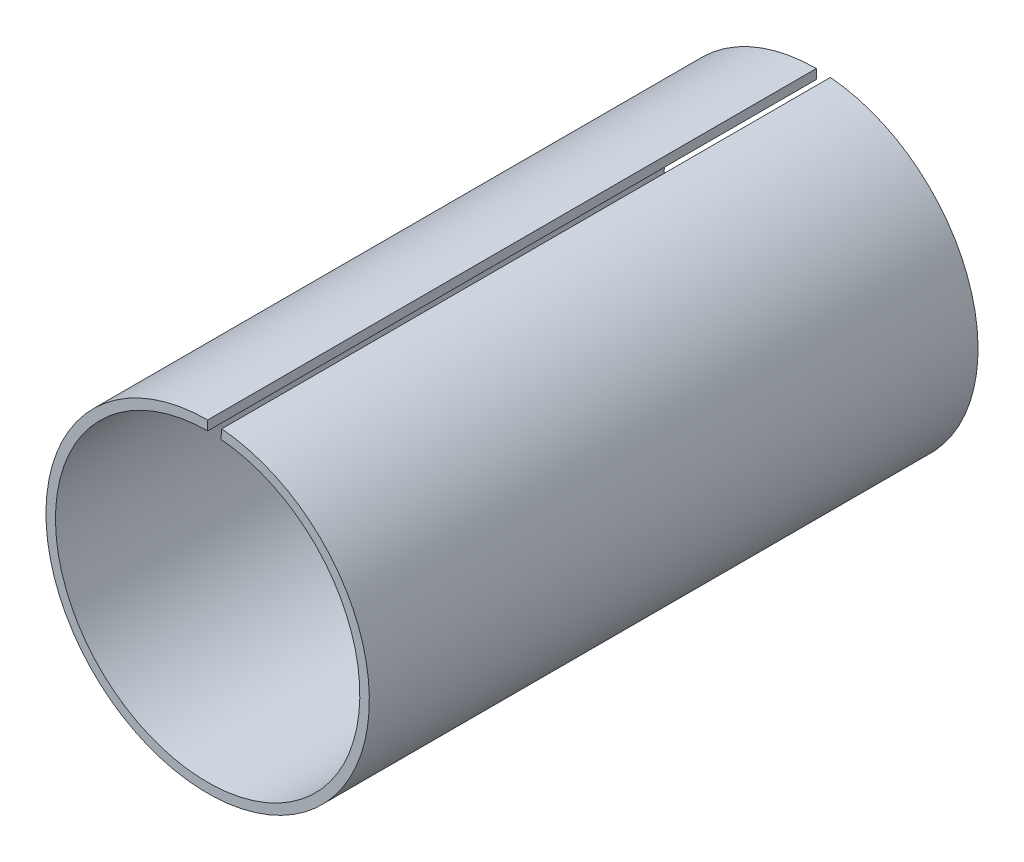
ISO-10303-21;
HEADER;
FILE_DESCRIPTION(('STEP AP214'),'2;1');
FILE_NAME('part.step','',(''),(''),'','','');
FILE_SCHEMA(('AUTOMOTIVE_DESIGN { 1 0 10303 214 1 1 1 1 }'));
ENDSEC;
DATA;
#1=APPLICATION_CONTEXT('core data for automotive mechanical design processes');
#2=APPLICATION_PROTOCOL_DEFINITION('international standard','automotive_design',2000,#1);
#3=PRODUCT_CONTEXT('',#1,'mechanical');
#4=PRODUCT('Part','Part','',(#3));
#5=PRODUCT_RELATED_PRODUCT_CATEGORY('part','',(#4));
#6=PRODUCT_DEFINITION_FORMATION('','',#4);
#7=PRODUCT_DEFINITION_CONTEXT('part definition',#1,'design');
#8=PRODUCT_DEFINITION('design','',#6,#7);
#9=PRODUCT_DEFINITION_SHAPE('','',#8);
#10=(LENGTH_UNIT() NAMED_UNIT(*) SI_UNIT(.MILLI.,.METRE.));
#11=(NAMED_UNIT(*) PLANE_ANGLE_UNIT() SI_UNIT($,.RADIAN.));
#12=(NAMED_UNIT(*) SI_UNIT($,.STERADIAN.) SOLID_ANGLE_UNIT());
#13=UNCERTAINTY_MEASURE_WITH_UNIT(LENGTH_MEASURE(1.E-05),#10,'distance_accuracy_value','');
#14=(GEOMETRIC_REPRESENTATION_CONTEXT(3) GLOBAL_UNCERTAINTY_ASSIGNED_CONTEXT((#13)) GLOBAL_UNIT_ASSIGNED_CONTEXT((#10,
#11,#12)) REPRESENTATION_CONTEXT('',''));
#15=CARTESIAN_POINT('',(0.,0.,0.));
#16=DIRECTION('',(0.,0.,1.));
#17=DIRECTION('',(1.,0.,0.));
#18=AXIS2_PLACEMENT_3D('',#15,#16,#17);
#19=CARTESIAN_POINT('',(0.,0.,50.8));
#20=DIRECTION('',(0.,0.,1.));
#21=DIRECTION('',(1.,0.,0.));
#22=AXIS2_PLACEMENT_3D('',#19,#20,#21);
#23=PLANE('',#22);
#24=DIRECTION('',(0.0871557427476584,0.996194698091746,0.));
#25=VECTOR('',#24,1.);
#26=CARTESIAN_POINT('',(0.,0.,50.8));
#27=LINE('',#26,#25);
#28=CARTESIAN_POINT('',(1.10687793289526,12.6516726657652,50.8));
#29=VERTEX_POINT('',#28);
#30=CARTESIAN_POINT('',(1.17605780370121,13.4424022073755,50.8));
#31=VERTEX_POINT('',#30);
#32=EDGE_CURVE('E75',#29,#31,#27,.T.);
#33=ORIENTED_EDGE('',*,*,#32,.F.);
#34=CARTESIAN_POINT('',(0.,0.,50.8));
#35=DIRECTION('',(0.,0.,1.));
#36=DIRECTION('',(1.,0.,0.));
#37=AXIS2_PLACEMENT_3D('',#34,#35,#36);
#38=CIRCLE('',#37,12.7);
#39=CARTESIAN_POINT('',(0.,12.7,50.8));
#40=VERTEX_POINT('',#39);
#41=EDGE_CURVE('E94',#40,#29,#38,.T.);
#42=ORIENTED_EDGE('',*,*,#41,.F.);
#43=DIRECTION('',(0.,-1.,0.));
#44=VECTOR('',#43,1.);
#45=CARTESIAN_POINT('',(0.,0.,50.8));
#46=LINE('',#45,#44);
#47=CARTESIAN_POINT('',(0.,13.49375,50.8));
#48=VERTEX_POINT('',#47);
#49=EDGE_CURVE('E56',#48,#40,#46,.T.);
#50=ORIENTED_EDGE('',*,*,#49,.F.);
#51=CARTESIAN_POINT('',(0.,0.,50.8));
#52=DIRECTION('',(0.,0.,1.));
#53=DIRECTION('',(1.,0.,0.));
#54=AXIS2_PLACEMENT_3D('',#51,#52,#53);
#55=CIRCLE('',#54,13.49375);
#56=EDGE_CURVE('E93',#48,#31,#55,.T.);
#57=ORIENTED_EDGE('',*,*,#56,.T.);
#58=EDGE_LOOP('',(#33,#42,#50,#57));
#59=FACE_BOUND('',#58,.T.);
#60=ADVANCED_FACE('F34',(#59),#23,.T.);
#61=CARTESIAN_POINT('',(0.,0.,0.));
#62=DIRECTION('',(0.,0.,1.));
#63=DIRECTION('',(1.,0.,0.));
#64=AXIS2_PLACEMENT_3D('',#61,#62,#63);
#65=PLANE('',#64);
#66=CARTESIAN_POINT('',(0.,0.,0.));
#67=DIRECTION('',(0.,0.,1.));
#68=DIRECTION('',(1.,0.,0.));
#69=AXIS2_PLACEMENT_3D('',#66,#67,#68);
#70=CIRCLE('',#69,12.7);
#71=CARTESIAN_POINT('',(0.,12.7,0.));
#72=VERTEX_POINT('',#71);
#73=CARTESIAN_POINT('',(1.10687793289526,12.6516726657652,0.));
#74=VERTEX_POINT('',#73);
#75=EDGE_CURVE('E90',#72,#74,#70,.T.);
#76=ORIENTED_EDGE('',*,*,#75,.T.);
#77=DIRECTION('',(0.0871557427476584,0.996194698091746,0.));
#78=VECTOR('',#77,1.);
#79=CARTESIAN_POINT('',(0.,0.,0.));
#80=LINE('',#79,#78);
#81=CARTESIAN_POINT('',(1.17605780370121,13.4424022073755,0.));
#82=VERTEX_POINT('',#81);
#83=EDGE_CURVE('E48',#74,#82,#80,.T.);
#84=ORIENTED_EDGE('',*,*,#83,.T.);
#85=CARTESIAN_POINT('',(0.,0.,0.));
#86=DIRECTION('',(0.,0.,1.));
#87=DIRECTION('',(1.,0.,0.));
#88=AXIS2_PLACEMENT_3D('',#85,#86,#87);
#89=CIRCLE('',#88,13.49375);
#90=CARTESIAN_POINT('',(0.,13.49375,0.));
#91=VERTEX_POINT('',#90);
#92=EDGE_CURVE('E88',#91,#82,#89,.T.);
#93=ORIENTED_EDGE('',*,*,#92,.F.);
#94=DIRECTION('',(0.,-1.,0.));
#95=VECTOR('',#94,1.);
#96=CARTESIAN_POINT('',(0.,0.,0.));
#97=LINE('',#96,#95);
#98=EDGE_CURVE('E81',#91,#72,#97,.T.);
#99=ORIENTED_EDGE('',*,*,#98,.T.);
#100=EDGE_LOOP('',(#76,#84,#93,#99));
#101=FACE_BOUND('',#100,.T.);
#102=ADVANCED_FACE('F86',(#101),#65,.F.);
#103=CARTESIAN_POINT('',(0.,0.,50.8));
#104=DIRECTION('',(0.,0.,-1.));
#105=DIRECTION('',(-1.,0.,0.));
#106=AXIS2_PLACEMENT_3D('',#103,#104,#105);
#107=CYLINDRICAL_SURFACE('',#106,13.49375);
#108=ORIENTED_EDGE('',*,*,#92,.T.);
#109=DIRECTION('',(0.,0.,1.));
#110=VECTOR('',#109,1.);
#111=CARTESIAN_POINT('',(1.17605780370121,13.4424022073755,0.));
#112=LINE('',#111,#110);
#113=EDGE_CURVE('E72',#82,#31,#112,.T.);
#114=ORIENTED_EDGE('',*,*,#113,.T.);
#115=ORIENTED_EDGE('',*,*,#56,.F.);
#116=DIRECTION('',(0.,0.,1.));
#117=VECTOR('',#116,1.);
#118=CARTESIAN_POINT('',(0.,13.49375,0.));
#119=LINE('',#118,#117);
#120=EDGE_CURVE('E80',#91,#48,#119,.T.);
#121=ORIENTED_EDGE('',*,*,#120,.F.);
#122=EDGE_LOOP('',(#108,#114,#115,#121));
#123=FACE_BOUND('',#122,.T.);
#124=ADVANCED_FACE('F36',(#123),#107,.T.);
#125=CARTESIAN_POINT('',(0.,0.,50.8));
#126=DIRECTION('',(0.,0.,-1.));
#127=DIRECTION('',(-1.,0.,0.));
#128=AXIS2_PLACEMENT_3D('',#125,#126,#127);
#129=CYLINDRICAL_SURFACE('',#128,12.7);
#130=DIRECTION('',(0.,0.,-1.));
#131=VECTOR('',#130,1.);
#132=CARTESIAN_POINT('',(1.10687793289526,12.6516726657652,50.8));
#133=LINE('',#132,#131);
#134=EDGE_CURVE('E11',#74,#29,#133,.F.);
#135=ORIENTED_EDGE('',*,*,#134,.F.);
#136=ORIENTED_EDGE('',*,*,#75,.F.);
#137=DIRECTION('',(0.,0.,-1.));
#138=VECTOR('',#137,1.);
#139=CARTESIAN_POINT('',(0.,12.7,50.8));
#140=LINE('',#139,#138);
#141=EDGE_CURVE('E42',#40,#72,#140,.T.);
#142=ORIENTED_EDGE('',*,*,#141,.F.);
#143=ORIENTED_EDGE('',*,*,#41,.T.);
#144=EDGE_LOOP('',(#135,#136,#142,#143));
#145=FACE_BOUND('',#144,.T.);
#146=ADVANCED_FACE('F104',(#145),#129,.F.);
#147=CARTESIAN_POINT('',(0.,0.,0.));
#148=DIRECTION('',(-1.,0.,0.));
#149=DIRECTION('',(0.,0.,1.));
#150=AXIS2_PLACEMENT_3D('',#147,#148,#149);
#151=PLANE('',#150);
#152=ORIENTED_EDGE('',*,*,#141,.T.);
#153=ORIENTED_EDGE('',*,*,#98,.F.);
#154=ORIENTED_EDGE('',*,*,#120,.T.);
#155=ORIENTED_EDGE('',*,*,#49,.T.);
#156=EDGE_LOOP('',(#152,#153,#154,#155));
#157=FACE_BOUND('',#156,.T.);
#158=ADVANCED_FACE('F100',(#157),#151,.F.);
#159=CARTESIAN_POINT('',(0.,0.,0.));
#160=DIRECTION('',(0.996194698091746,-0.0871557427476584,0.));
#161=DIRECTION('',(0.0871557427476584,0.996194698091746,0.));
#162=AXIS2_PLACEMENT_3D('',#159,#160,#161);
#163=PLANE('',#162);
#164=ORIENTED_EDGE('',*,*,#134,.T.);
#165=ORIENTED_EDGE('',*,*,#32,.T.);
#166=ORIENTED_EDGE('',*,*,#113,.F.);
#167=ORIENTED_EDGE('',*,*,#83,.F.);
#168=EDGE_LOOP('',(#164,#165,#166,#167));
#169=FACE_BOUND('',#168,.T.);
#170=ADVANCED_FACE('F73',(#169),#163,.F.);
#171=CLOSED_SHELL('',(#60,#102,#124,#146,#158,#170));
#172=MANIFOLD_SOLID_BREP('B2',#171);
#173=ADVANCED_BREP_SHAPE_REPRESENTATION('',(#18,#172),#14);
#174=SHAPE_DEFINITION_REPRESENTATION(#9,#173);
ENDSEC;
END-ISO-10303-21;
